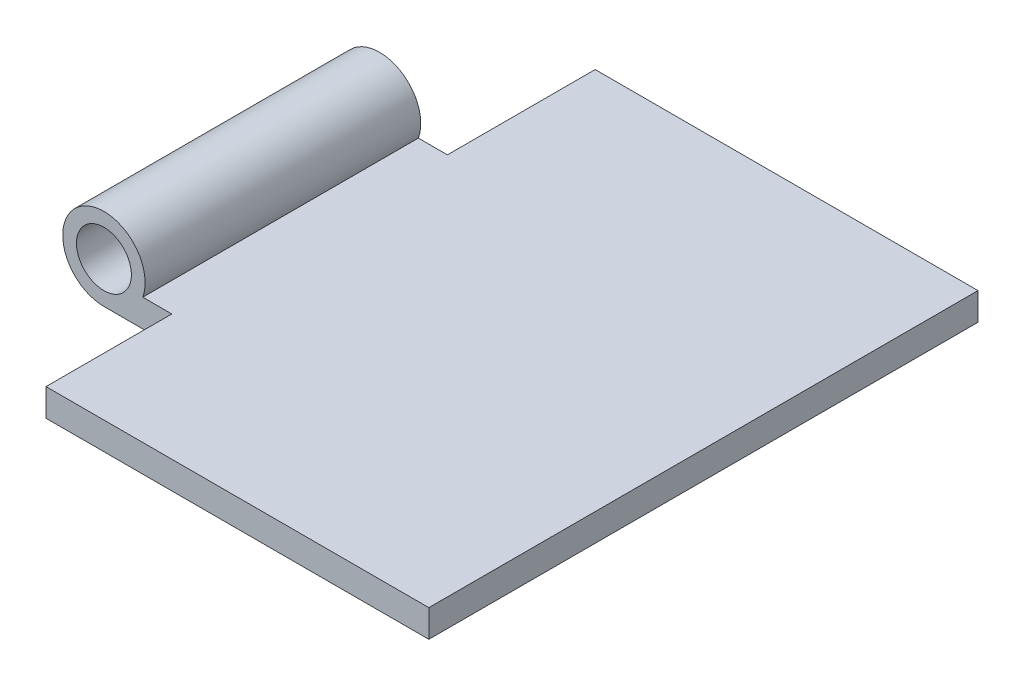
ISO-10303-21;
HEADER;
FILE_DESCRIPTION(('STEP AP214'),'2;1');
FILE_NAME('part.step','',(''),(''),'','','');
FILE_SCHEMA(('AUTOMOTIVE_DESIGN { 1 0 10303 214 1 1 1 1 }'));
ENDSEC;
DATA;
#1=APPLICATION_CONTEXT('core data for automotive mechanical design processes');
#2=APPLICATION_PROTOCOL_DEFINITION('international standard','automotive_design',2000,#1);
#3=PRODUCT_CONTEXT('',#1,'mechanical');
#4=PRODUCT('Part','Part','',(#3));
#5=PRODUCT_RELATED_PRODUCT_CATEGORY('part','',(#4));
#6=PRODUCT_DEFINITION_FORMATION('','',#4);
#7=PRODUCT_DEFINITION_CONTEXT('part definition',#1,'design');
#8=PRODUCT_DEFINITION('design','',#6,#7);
#9=PRODUCT_DEFINITION_SHAPE('','',#8);
#10=(LENGTH_UNIT() NAMED_UNIT(*) SI_UNIT(.MILLI.,.METRE.));
#11=(NAMED_UNIT(*) PLANE_ANGLE_UNIT() SI_UNIT($,.RADIAN.));
#12=(NAMED_UNIT(*) SI_UNIT($,.STERADIAN.) SOLID_ANGLE_UNIT());
#13=UNCERTAINTY_MEASURE_WITH_UNIT(LENGTH_MEASURE(1.E-05),#10,'distance_accuracy_value','');
#14=(GEOMETRIC_REPRESENTATION_CONTEXT(3) GLOBAL_UNCERTAINTY_ASSIGNED_CONTEXT((#13)) GLOBAL_UNIT_ASSIGNED_CONTEXT((#10,
#11,#12)) REPRESENTATION_CONTEXT('',''));
#15=CARTESIAN_POINT('',(0.,0.,0.));
#16=DIRECTION('',(0.,0.,1.));
#17=DIRECTION('',(1.,0.,0.));
#18=AXIS2_PLACEMENT_3D('',#15,#16,#17);
#19=CARTESIAN_POINT('',(0.,0.,40.));
#20=DIRECTION('',(0.,0.,1.));
#21=DIRECTION('',(1.,0.,0.));
#22=AXIS2_PLACEMENT_3D('',#19,#20,#21);
#23=PLANE('',#22);
#24=DIRECTION('',(0.,1.,0.));
#25=VECTOR('',#24,1.);
#26=CARTESIAN_POINT('',(4.94304546899934,0.,40.));
#27=LINE('',#26,#25);
#28=CARTESIAN_POINT('',(4.94304546899934,-3.,40.));
#29=VERTEX_POINT('',#28);
#30=CARTESIAN_POINT('',(4.94304546899934,-1.,40.));
#31=VERTEX_POINT('',#30);
#32=EDGE_CURVE('E45',#29,#31,#27,.T.);
#33=ORIENTED_EDGE('',*,*,#32,.F.);
#34=DIRECTION('',(1.,0.,0.));
#35=VECTOR('',#34,1.);
#36=CARTESIAN_POINT('',(0.,-3.,40.));
#37=LINE('',#36,#35);
#38=CARTESIAN_POINT('',(32.8284271247462,-3.,40.));
#39=VERTEX_POINT('',#38);
#40=EDGE_CURVE('E113',#29,#39,#37,.T.);
#41=ORIENTED_EDGE('',*,*,#40,.T.);
#42=DIRECTION('',(0.,1.,0.));
#43=VECTOR('',#42,1.);
#44=CARTESIAN_POINT('',(32.8284271247462,-1.,40.));
#45=LINE('',#44,#43);
#46=CARTESIAN_POINT('',(32.8284271247462,-1.,40.));
#47=VERTEX_POINT('',#46);
#48=EDGE_CURVE('E137',#39,#47,#45,.T.);
#49=ORIENTED_EDGE('',*,*,#48,.T.);
#50=DIRECTION('',(-1.,0.,0.));
#51=VECTOR('',#50,1.);
#52=CARTESIAN_POINT('',(2.82842712474619,-1.,40.));
#53=LINE('',#52,#51);
#54=EDGE_CURVE('E140',#47,#31,#53,.T.);
#55=ORIENTED_EDGE('',*,*,#54,.T.);
#56=EDGE_LOOP('',(#33,#41,#49,#55));
#57=FACE_BOUND('',#56,.T.);
#58=ADVANCED_FACE('F30',(#57),#23,.T.);
#59=CARTESIAN_POINT('',(0.,0.,0.));
#60=DIRECTION('',(0.,0.,1.));
#61=DIRECTION('',(1.,0.,0.));
#62=AXIS2_PLACEMENT_3D('',#59,#60,#61);
#63=PLANE('',#62);
#64=DIRECTION('',(1.,0.,0.));
#65=VECTOR('',#64,1.);
#66=CARTESIAN_POINT('',(0.,-3.,0.));
#67=LINE('',#66,#65);
#68=CARTESIAN_POINT('',(4.94304546899934,-3.,0.));
#69=VERTEX_POINT('',#68);
#70=CARTESIAN_POINT('',(32.8284271247462,-3.,0.));
#71=VERTEX_POINT('',#70);
#72=EDGE_CURVE('E135',#69,#71,#67,.T.);
#73=ORIENTED_EDGE('',*,*,#72,.F.);
#74=DIRECTION('',(0.,1.,0.));
#75=VECTOR('',#74,1.);
#76=CARTESIAN_POINT('',(4.94304546899934,0.,0.));
#77=LINE('',#76,#75);
#78=CARTESIAN_POINT('',(4.94304546899934,-1.,0.));
#79=VERTEX_POINT('',#78);
#80=EDGE_CURVE('E129',#69,#79,#77,.T.);
#81=ORIENTED_EDGE('',*,*,#80,.T.);
#82=DIRECTION('',(-1.,0.,0.));
#83=VECTOR('',#82,1.);
#84=CARTESIAN_POINT('',(2.82842712474619,-1.,0.));
#85=LINE('',#84,#83);
#86=CARTESIAN_POINT('',(32.8284271247462,-1.,0.));
#87=VERTEX_POINT('',#86);
#88=EDGE_CURVE('E138',#87,#79,#85,.T.);
#89=ORIENTED_EDGE('',*,*,#88,.F.);
#90=DIRECTION('',(0.,1.,0.));
#91=VECTOR('',#90,1.);
#92=CARTESIAN_POINT('',(32.8284271247462,-1.,0.));
#93=LINE('',#92,#91);
#94=EDGE_CURVE('E144',#71,#87,#93,.T.);
#95=ORIENTED_EDGE('',*,*,#94,.F.);
#96=EDGE_LOOP('',(#73,#81,#89,#95));
#97=FACE_BOUND('',#96,.T.);
#98=ADVANCED_FACE('F177',(#97),#63,.F.);
#99=CARTESIAN_POINT('',(0.,0.,40.));
#100=DIRECTION('',(0.,0.,-1.));
#101=DIRECTION('',(-1.,0.,0.));
#102=AXIS2_PLACEMENT_3D('',#99,#100,#101);
#103=CYLINDRICAL_SURFACE('',#102,3.);
#104=DIRECTION('',(0.,0.,-1.));
#105=VECTOR('',#104,1.);
#106=CARTESIAN_POINT('',(0.,-3.,40.));
#107=LINE('',#106,#105);
#108=CARTESIAN_POINT('',(0.,-3.,30.8379458900325));
#109=VERTEX_POINT('',#108);
#110=CARTESIAN_POINT('',(0.,-3.,10.7624885470052));
#111=VERTEX_POINT('',#110);
#112=EDGE_CURVE('E155',#109,#111,#107,.T.);
#113=ORIENTED_EDGE('',*,*,#112,.F.);
#114=CARTESIAN_POINT('',(0.,0.,30.8379458900325));
#115=DIRECTION('',(0.,0.,-1.));
#116=DIRECTION('',(-1.,0.,0.));
#117=AXIS2_PLACEMENT_3D('',#114,#115,#116);
#118=CIRCLE('',#117,3.);
#119=CARTESIAN_POINT('',(2.82842712474619,-1.,30.8379458900325));
#120=VERTEX_POINT('',#119);
#121=EDGE_CURVE('E101',#109,#120,#118,.T.);
#122=ORIENTED_EDGE('',*,*,#121,.T.);
#123=DIRECTION('',(0.,0.,-1.));
#124=VECTOR('',#123,1.);
#125=CARTESIAN_POINT('',(2.82842712474619,-1.,40.));
#126=LINE('',#125,#124);
#127=CARTESIAN_POINT('',(2.82842712474619,-1.,10.7624885470052));
#128=VERTEX_POINT('',#127);
#129=EDGE_CURVE('E52',#120,#128,#126,.T.);
#130=ORIENTED_EDGE('',*,*,#129,.T.);
#131=CARTESIAN_POINT('',(0.,0.,10.7624885470052));
#132=DIRECTION('',(0.,0.,1.));
#133=DIRECTION('',(1.,0.,0.));
#134=AXIS2_PLACEMENT_3D('',#131,#132,#133);
#135=CIRCLE('',#134,3.);
#136=EDGE_CURVE('E124',#128,#111,#135,.T.);
#137=ORIENTED_EDGE('',*,*,#136,.T.);
#138=EDGE_LOOP('',(#113,#122,#130,#137));
#139=FACE_BOUND('',#138,.T.);
#140=ADVANCED_FACE('F32',(#139),#103,.T.);
#141=CARTESIAN_POINT('',(0.,-3.,40.));
#142=DIRECTION('',(0.,1.,0.));
#143=DIRECTION('',(0.,0.,1.));
#144=AXIS2_PLACEMENT_3D('',#141,#142,#143);
#145=PLANE('',#144);
#146=DIRECTION('',(0.,0.,-1.));
#147=VECTOR('',#146,1.);
#148=CARTESIAN_POINT('',(4.94304546899934,-3.,40.));
#149=LINE('',#148,#147);
#150=CARTESIAN_POINT('',(4.94304546899934,-3.,30.8379458900325));
#151=VERTEX_POINT('',#150);
#152=EDGE_CURVE('E107',#29,#151,#149,.T.);
#153=ORIENTED_EDGE('',*,*,#152,.T.);
#154=DIRECTION('',(-1.,0.,0.));
#155=VECTOR('',#154,1.);
#156=CARTESIAN_POINT('',(0.,-3.,30.8379458900325));
#157=LINE('',#156,#155);
#158=EDGE_CURVE('E96',#151,#109,#157,.T.);
#159=ORIENTED_EDGE('',*,*,#158,.T.);
#160=ORIENTED_EDGE('',*,*,#112,.T.);
#161=DIRECTION('',(1.,0.,0.));
#162=VECTOR('',#161,1.);
#163=CARTESIAN_POINT('',(0.,-3.,10.7624885470052));
#164=LINE('',#163,#162);
#165=CARTESIAN_POINT('',(4.94304546899934,-3.,10.7624885470052));
#166=VERTEX_POINT('',#165);
#167=EDGE_CURVE('E126',#111,#166,#164,.T.);
#168=ORIENTED_EDGE('',*,*,#167,.T.);
#169=DIRECTION('',(0.,0.,-1.));
#170=VECTOR('',#169,1.);
#171=CARTESIAN_POINT('',(4.94304546899934,-3.,40.));
#172=LINE('',#171,#170);
#173=EDGE_CURVE('E132',#166,#69,#172,.T.);
#174=ORIENTED_EDGE('',*,*,#173,.T.);
#175=ORIENTED_EDGE('',*,*,#72,.T.);
#176=DIRECTION('',(0.,0.,-1.));
#177=VECTOR('',#176,1.);
#178=CARTESIAN_POINT('',(32.8284271247462,-3.,40.));
#179=LINE('',#178,#177);
#180=EDGE_CURVE('E152',#39,#71,#179,.T.);
#181=ORIENTED_EDGE('',*,*,#180,.F.);
#182=ORIENTED_EDGE('',*,*,#40,.F.);
#183=EDGE_LOOP('',(#153,#159,#160,#168,#174,#175,#181,#182));
#184=FACE_BOUND('',#183,.T.);
#185=ADVANCED_FACE('F111',(#184),#145,.F.);
#186=CARTESIAN_POINT('',(32.8284271247462,-1.,40.));
#187=DIRECTION('',(-1.,0.,0.));
#188=DIRECTION('',(0.,0.,1.));
#189=AXIS2_PLACEMENT_3D('',#186,#187,#188);
#190=PLANE('',#189);
#191=ORIENTED_EDGE('',*,*,#94,.T.);
#192=DIRECTION('',(0.,0.,-1.));
#193=VECTOR('',#192,1.);
#194=CARTESIAN_POINT('',(32.8284271247462,-1.,40.));
#195=LINE('',#194,#193);
#196=EDGE_CURVE('E149',#47,#87,#195,.T.);
#197=ORIENTED_EDGE('',*,*,#196,.F.);
#198=ORIENTED_EDGE('',*,*,#48,.F.);
#199=ORIENTED_EDGE('',*,*,#180,.T.);
#200=EDGE_LOOP('',(#191,#197,#198,#199));
#201=FACE_BOUND('',#200,.T.);
#202=ADVANCED_FACE('F181',(#201),#190,.F.);
#203=CARTESIAN_POINT('',(2.82842712474619,-1.,40.));
#204=DIRECTION('',(0.,-1.,0.));
#205=DIRECTION('',(0.,0.,-1.));
#206=AXIS2_PLACEMENT_3D('',#203,#204,#205);
#207=PLANE('',#206);
#208=ORIENTED_EDGE('',*,*,#129,.F.);
#209=DIRECTION('',(1.,0.,0.));
#210=VECTOR('',#209,1.);
#211=CARTESIAN_POINT('',(2.82842712474619,-1.,30.8379458900325));
#212=LINE('',#211,#210);
#213=CARTESIAN_POINT('',(4.94304546899934,-1.,30.8379458900325));
#214=VERTEX_POINT('',#213);
#215=EDGE_CURVE('E161',#120,#214,#212,.T.);
#216=ORIENTED_EDGE('',*,*,#215,.T.);
#217=DIRECTION('',(0.,0.,1.));
#218=VECTOR('',#217,1.);
#219=CARTESIAN_POINT('',(4.94304546899934,-1.,40.));
#220=LINE('',#219,#218);
#221=EDGE_CURVE('E11',#214,#31,#220,.T.);
#222=ORIENTED_EDGE('',*,*,#221,.T.);
#223=ORIENTED_EDGE('',*,*,#54,.F.);
#224=ORIENTED_EDGE('',*,*,#196,.T.);
#225=ORIENTED_EDGE('',*,*,#88,.T.);
#226=DIRECTION('',(0.,0.,1.));
#227=VECTOR('',#226,1.);
#228=CARTESIAN_POINT('',(4.94304546899934,-1.,40.));
#229=LINE('',#228,#227);
#230=CARTESIAN_POINT('',(4.94304546899934,-1.,10.7624885470052));
#231=VERTEX_POINT('',#230);
#232=EDGE_CURVE('E38',#79,#231,#229,.T.);
#233=ORIENTED_EDGE('',*,*,#232,.T.);
#234=DIRECTION('',(-1.,0.,0.));
#235=VECTOR('',#234,1.);
#236=CARTESIAN_POINT('',(2.82842712474619,-1.,10.7624885470052));
#237=LINE('',#236,#235);
#238=EDGE_CURVE('E121',#231,#128,#237,.T.);
#239=ORIENTED_EDGE('',*,*,#238,.T.);
#240=EDGE_LOOP('',(#208,#216,#222,#223,#224,#225,#233,#239));
#241=FACE_BOUND('',#240,.T.);
#242=ADVANCED_FACE('F167',(#241),#207,.F.);
#243=CARTESIAN_POINT('',(0.,0.,40.));
#244=DIRECTION('',(0.,0.,-1.));
#245=DIRECTION('',(-1.,0.,0.));
#246=AXIS2_PLACEMENT_3D('',#243,#244,#245);
#247=CYLINDRICAL_SURFACE('',#246,2.);
#248=CARTESIAN_POINT('',(0.,0.,30.8379458900325));
#249=DIRECTION('',(0.,0.,-1.));
#250=DIRECTION('',(-1.,0.,0.));
#251=AXIS2_PLACEMENT_3D('',#248,#249,#250);
#252=CIRCLE('',#251,2.);
#253=CARTESIAN_POINT('',(-2.,0.,30.8379458900325));
#254=VERTEX_POINT('',#253);
#255=EDGE_CURVE('E108',#254,#254,#252,.T.);
#256=ORIENTED_EDGE('',*,*,#255,.F.);
#257=EDGE_LOOP('',(#256));
#258=FACE_BOUND('',#257,.T.);
#259=CARTESIAN_POINT('',(0.,0.,10.7624885470052));
#260=DIRECTION('',(0.,0.,1.));
#261=DIRECTION('',(1.,0.,0.));
#262=AXIS2_PLACEMENT_3D('',#259,#260,#261);
#263=CIRCLE('',#262,2.);
#264=CARTESIAN_POINT('',(2.,0.,10.7624885470052));
#265=VERTEX_POINT('',#264);
#266=EDGE_CURVE('E117',#265,#265,#263,.T.);
#267=ORIENTED_EDGE('',*,*,#266,.F.);
#268=EDGE_LOOP('',(#267));
#269=FACE_BOUND('',#268,.T.);
#270=ADVANCED_FACE('F193',(#258,#269),#247,.F.);
#271=CARTESIAN_POINT('',(4.94304546899934,-20.,10.7624885470052));
#272=DIRECTION('',(1.,0.,0.));
#273=DIRECTION('',(0.,0.,-1.));
#274=AXIS2_PLACEMENT_3D('',#271,#272,#273);
#275=PLANE('',#274);
#276=DIRECTION('',(0.,1.,0.));
#277=VECTOR('',#276,1.);
#278=CARTESIAN_POINT('',(4.94304546899934,-20.,10.7624885470052));
#279=LINE('',#278,#277);
#280=EDGE_CURVE('E114',#166,#231,#279,.T.);
#281=ORIENTED_EDGE('',*,*,#280,.T.);
#282=ORIENTED_EDGE('',*,*,#232,.F.);
#283=ORIENTED_EDGE('',*,*,#80,.F.);
#284=ORIENTED_EDGE('',*,*,#173,.F.);
#285=EDGE_LOOP('',(#281,#282,#283,#284));
#286=FACE_BOUND('',#285,.T.);
#287=ADVANCED_FACE('F173',(#286),#275,.F.);
#288=CARTESIAN_POINT('',(4.94304546899934,-20.,10.7624885470052));
#289=DIRECTION('',(0.,0.,1.));
#290=DIRECTION('',(1.,0.,0.));
#291=AXIS2_PLACEMENT_3D('',#288,#289,#290);
#292=PLANE('',#291);
#293=ORIENTED_EDGE('',*,*,#266,.T.);
#294=EDGE_LOOP('',(#293));
#295=FACE_BOUND('',#294,.T.);
#296=ORIENTED_EDGE('',*,*,#136,.F.);
#297=ORIENTED_EDGE('',*,*,#238,.F.);
#298=ORIENTED_EDGE('',*,*,#280,.F.);
#299=ORIENTED_EDGE('',*,*,#167,.F.);
#300=EDGE_LOOP('',(#296,#297,#298,#299));
#301=FACE_BOUND('',#300,.T.);
#302=ADVANCED_FACE('F170',(#295,#301),#292,.F.);
#303=CARTESIAN_POINT('',(4.94304546899934,-20.,30.8379458900325));
#304=DIRECTION('',(1.,0.,0.));
#305=DIRECTION('',(0.,0.,-1.));
#306=AXIS2_PLACEMENT_3D('',#303,#304,#305);
#307=PLANE('',#306);
#308=ORIENTED_EDGE('',*,*,#32,.T.);
#309=ORIENTED_EDGE('',*,*,#221,.F.);
#310=DIRECTION('',(0.,1.,0.));
#311=VECTOR('',#310,1.);
#312=CARTESIAN_POINT('',(4.94304546899934,-20.,30.8379458900325));
#313=LINE('',#312,#311);
#314=EDGE_CURVE('E99',#151,#214,#313,.T.);
#315=ORIENTED_EDGE('',*,*,#314,.F.);
#316=ORIENTED_EDGE('',*,*,#152,.F.);
#317=EDGE_LOOP('',(#308,#309,#315,#316));
#318=FACE_BOUND('',#317,.T.);
#319=ADVANCED_FACE('F106',(#318),#307,.F.);
#320=CARTESIAN_POINT('',(4.94304546899934,-20.,30.8379458900325));
#321=DIRECTION('',(0.,0.,-1.));
#322=DIRECTION('',(-1.,0.,0.));
#323=AXIS2_PLACEMENT_3D('',#320,#321,#322);
#324=PLANE('',#323);
#325=ORIENTED_EDGE('',*,*,#255,.T.);
#326=EDGE_LOOP('',(#325));
#327=FACE_BOUND('',#326,.T.);
#328=ORIENTED_EDGE('',*,*,#314,.T.);
#329=ORIENTED_EDGE('',*,*,#215,.F.);
#330=ORIENTED_EDGE('',*,*,#121,.F.);
#331=ORIENTED_EDGE('',*,*,#158,.F.);
#332=EDGE_LOOP('',(#328,#329,#330,#331));
#333=FACE_BOUND('',#332,.T.);
#334=ADVANCED_FACE('F98',(#327,#333),#324,.F.);
#335=CLOSED_SHELL('',(#58,#98,#140,#185,#202,#242,#270,#287,#302,#319,#334));
#336=MANIFOLD_SOLID_BREP('B2',#335);
#337=ADVANCED_BREP_SHAPE_REPRESENTATION('',(#18,#336),#14);
#338=SHAPE_DEFINITION_REPRESENTATION(#9,#337);
ENDSEC;
END-ISO-10303-21;
